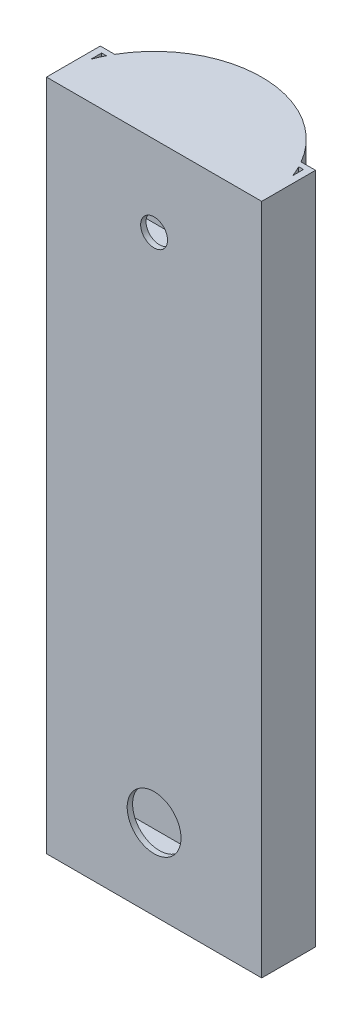
ISO-10303-21;
HEADER;
FILE_DESCRIPTION(('STEP AP214'),'2;1');
FILE_NAME('part.step','',(''),(''),'','','');
FILE_SCHEMA(('AUTOMOTIVE_DESIGN { 1 0 10303 214 1 1 1 1 }'));
ENDSEC;
DATA;
#1=APPLICATION_CONTEXT('core data for automotive mechanical design processes');
#2=APPLICATION_PROTOCOL_DEFINITION('international standard','automotive_design',2000,#1);
#3=PRODUCT_CONTEXT('',#1,'mechanical');
#4=PRODUCT('Part','Part','',(#3));
#5=PRODUCT_RELATED_PRODUCT_CATEGORY('part','',(#4));
#6=PRODUCT_DEFINITION_FORMATION('','',#4);
#7=PRODUCT_DEFINITION_CONTEXT('part definition',#1,'design');
#8=PRODUCT_DEFINITION('design','',#6,#7);
#9=PRODUCT_DEFINITION_SHAPE('','',#8);
#10=(LENGTH_UNIT() NAMED_UNIT(*) SI_UNIT(.MILLI.,.METRE.));
#11=(NAMED_UNIT(*) PLANE_ANGLE_UNIT() SI_UNIT($,.RADIAN.));
#12=(NAMED_UNIT(*) SI_UNIT($,.STERADIAN.) SOLID_ANGLE_UNIT());
#13=UNCERTAINTY_MEASURE_WITH_UNIT(LENGTH_MEASURE(1.E-05),#10,'distance_accuracy_value','');
#14=(GEOMETRIC_REPRESENTATION_CONTEXT(3) GLOBAL_UNCERTAINTY_ASSIGNED_CONTEXT((#13)) GLOBAL_UNIT_ASSIGNED_CONTEXT((#10,
#11,#12)) REPRESENTATION_CONTEXT('',''));
#15=CARTESIAN_POINT('',(0.,0.,0.));
#16=DIRECTION('',(0.,0.,1.));
#17=DIRECTION('',(1.,0.,0.));
#18=AXIS2_PLACEMENT_3D('',#15,#16,#17);
#19=CARTESIAN_POINT('',(-35.,245.,10.0000000000002));
#20=DIRECTION('',(0.,1.,0.));
#21=DIRECTION('',(-1.,0.,0.));
#22=AXIS2_PLACEMENT_3D('',#19,#20,#21);
#23=PLANE('',#22);
#24=CARTESIAN_POINT('',(0.,245.,10.));
#25=DIRECTION('',(0.,-1.,0.));
#26=DIRECTION('',(1.,0.,0.));
#27=AXIS2_PLACEMENT_3D('',#24,#25,#26);
#28=CIRCLE('',#27,35.);
#29=CARTESIAN_POINT('',(-28.7228132326901,245.,-10.));
#30=VERTEX_POINT('',#29);
#31=CARTESIAN_POINT('',(28.7228132326901,245.,-10.));
#32=VERTEX_POINT('',#31);
#33=EDGE_CURVE('E241',#30,#32,#28,.T.);
#34=ORIENTED_EDGE('',*,*,#33,.T.);
#35=DIRECTION('',(-1.,0.,0.));
#36=VECTOR('',#35,1.);
#37=CARTESIAN_POINT('',(40.,245.,-10.));
#38=LINE('',#37,#36);
#39=EDGE_CURVE('E509',#32,#30,#38,.T.);
#40=ORIENTED_EDGE('',*,*,#39,.T.);
#41=EDGE_LOOP('',(#34,#40));
#42=FACE_BOUND('',#41,.T.);
#43=ADVANCED_FACE('F41',(#42),#23,.F.);
#44=CARTESIAN_POINT('',(0.,0.,10.));
#45=DIRECTION('',(0.,-1.,0.));
#46=DIRECTION('',(1.,0.,0.));
#47=AXIS2_PLACEMENT_3D('',#44,#45,#46);
#48=CYLINDRICAL_SURFACE('',#47,35.);
#49=ORIENTED_EDGE('',*,*,#33,.F.);
#50=DIRECTION('',(0.,-1.,0.));
#51=VECTOR('',#50,1.);
#52=CARTESIAN_POINT('',(-28.7228132326901,0.,-10.));
#53=LINE('',#52,#51);
#54=CARTESIAN_POINT('',(-28.7228132326901,205.,-10.));
#55=VERTEX_POINT('',#54);
#56=EDGE_CURVE('E523',#30,#55,#53,.T.);
#57=ORIENTED_EDGE('',*,*,#56,.T.);
#58=CARTESIAN_POINT('',(0.,205.,10.));
#59=DIRECTION('',(0.,-1.,0.));
#60=DIRECTION('',(1.,0.,0.));
#61=AXIS2_PLACEMENT_3D('',#58,#59,#60);
#62=CIRCLE('',#61,35.);
#63=CARTESIAN_POINT('',(28.7228132326901,205.,-10.));
#64=VERTEX_POINT('',#63);
#65=EDGE_CURVE('E224',#55,#64,#62,.T.);
#66=ORIENTED_EDGE('',*,*,#65,.T.);
#67=DIRECTION('',(0.,-1.,0.));
#68=VECTOR('',#67,1.);
#69=CARTESIAN_POINT('',(28.7228132326901,0.,-10.));
#70=LINE('',#69,#68);
#71=EDGE_CURVE('E519',#64,#32,#70,.F.);
#72=ORIENTED_EDGE('',*,*,#71,.T.);
#73=EDGE_LOOP('',(#49,#57,#66,#72));
#74=FACE_BOUND('',#73,.T.);
#75=ADVANCED_FACE('F292',(#74),#48,.F.);
#76=CARTESIAN_POINT('',(0.,205.,10.));
#77=DIRECTION('',(0.,-1.,0.));
#78=DIRECTION('',(1.,0.,0.));
#79=AXIS2_PLACEMENT_3D('',#76,#77,#78);
#80=PLANE('',#79);
#81=CARTESIAN_POINT('',(0.,205.,-20.));
#82=DIRECTION('',(0.,-1.,0.));
#83=DIRECTION('',(1.,0.,0.));
#84=AXIS2_PLACEMENT_3D('',#81,#82,#83);
#85=CIRCLE('',#84,4.);
#86=CARTESIAN_POINT('',(4.,205.,-20.));
#87=VERTEX_POINT('',#86);
#88=EDGE_CURVE('E45',#87,#87,#85,.T.);
#89=ORIENTED_EDGE('',*,*,#88,.T.);
#90=EDGE_LOOP('',(#89));
#91=FACE_BOUND('',#90,.T.);
#92=ORIENTED_EDGE('',*,*,#65,.F.);
#93=DIRECTION('',(1.,0.,0.));
#94=VECTOR('',#93,1.);
#95=CARTESIAN_POINT('',(40.,205.,-10.));
#96=LINE('',#95,#94);
#97=EDGE_CURVE('E66',#55,#64,#96,.T.);
#98=ORIENTED_EDGE('',*,*,#97,.T.);
#99=EDGE_LOOP('',(#92,#98));
#100=FACE_BOUND('',#99,.T.);
#101=ADVANCED_FACE('F275',(#91,#100),#80,.F.);
#102=CARTESIAN_POINT('',(40.,200.,-10.));
#103=DIRECTION('',(0.,0.,1.));
#104=DIRECTION('',(1.,0.,0.));
#105=AXIS2_PLACEMENT_3D('',#102,#103,#104);
#106=PLANE('',#105);
#107=ORIENTED_EDGE('',*,*,#97,.F.);
#108=ORIENTED_EDGE('',*,*,#56,.F.);
#109=ORIENTED_EDGE('',*,*,#39,.F.);
#110=ORIENTED_EDGE('',*,*,#71,.F.);
#111=EDGE_LOOP('',(#107,#108,#109,#110));
#112=FACE_BOUND('',#111,.T.);
#113=ADVANCED_FACE('F281',(#112),#106,.F.);
#114=CARTESIAN_POINT('',(0.,215.,-20.));
#115=DIRECTION('',(0.,-1.,0.));
#116=DIRECTION('',(1.,0.,0.));
#117=AXIS2_PLACEMENT_3D('',#114,#115,#116);
#118=CYLINDRICAL_SURFACE('',#117,4.);
#119=CARTESIAN_POINT('',(0.,185.,-20.));
#120=DIRECTION('',(0.,-1.,0.));
#121=DIRECTION('',(0.,0.,-1.));
#122=AXIS2_PLACEMENT_3D('',#119,#120,#121);
#123=CIRCLE('',#122,4.);
#124=CARTESIAN_POINT('',(0.,185.,-24.));
#125=VERTEX_POINT('',#124);
#126=EDGE_CURVE('E266',#125,#125,#123,.T.);
#127=ORIENTED_EDGE('',*,*,#126,.T.);
#128=EDGE_LOOP('',(#127));
#129=FACE_BOUND('',#128,.T.);
#130=ORIENTED_EDGE('',*,*,#88,.F.);
#131=EDGE_LOOP('',(#130));
#132=FACE_BOUND('',#131,.T.);
#133=ADVANCED_FACE('F278',(#129,#132),#118,.F.);
#134=CARTESIAN_POINT('',(0.,40.,-10.));
#135=DIRECTION('',(0.,0.,1.));
#136=DIRECTION('',(1.,0.,0.));
#137=AXIS2_PLACEMENT_3D('',#134,#135,#136);
#138=CIRCLE('',#137,7.5);
#139=CARTESIAN_POINT('',(7.49999999999999,40.,-10.));
#140=VERTEX_POINT('',#139);
#141=EDGE_CURVE('E408',#140,#140,#138,.T.);
#142=ORIENTED_EDGE('',*,*,#141,.T.);
#143=EDGE_LOOP('',(#142));
#144=FACE_BOUND('',#143,.T.);
#145=DIRECTION('',(0.,-1.,0.));
#146=VECTOR('',#145,1.);
#147=CARTESIAN_POINT('',(-34.6410161513775,0.,-10.));
#148=LINE('',#147,#146);
#149=CARTESIAN_POINT('',(-34.6410161513775,200.,-10.));
#150=VERTEX_POINT('',#149);
#151=CARTESIAN_POINT('',(-34.6410161513775,250.,-10.));
#152=VERTEX_POINT('',#151);
#153=EDGE_CURVE('E499',#150,#152,#148,.F.);
#154=ORIENTED_EDGE('',*,*,#153,.F.);
#155=DIRECTION('',(-1.,0.,0.));
#156=VECTOR('',#155,1.);
#157=CARTESIAN_POINT('',(40.,200.,-10.));
#158=LINE('',#157,#156);
#159=CARTESIAN_POINT('',(34.6410161513775,200.,-10.));
#160=VERTEX_POINT('',#159);
#161=EDGE_CURVE('E58',#160,#150,#158,.T.);
#162=ORIENTED_EDGE('',*,*,#161,.F.);
#163=DIRECTION('',(0.,-1.,0.));
#164=VECTOR('',#163,1.);
#165=CARTESIAN_POINT('',(34.6410161513775,0.,-10.));
#166=LINE('',#165,#164);
#167=CARTESIAN_POINT('',(34.6410161513775,250.,-10.));
#168=VERTEX_POINT('',#167);
#169=EDGE_CURVE('E496',#168,#160,#166,.T.);
#170=ORIENTED_EDGE('',*,*,#169,.F.);
#171=DIRECTION('',(-1.,0.,0.));
#172=VECTOR('',#171,1.);
#173=CARTESIAN_POINT('',(0.,250.,-10.));
#174=LINE('',#173,#172);
#175=CARTESIAN_POINT('',(40.,250.,-10.));
#176=VERTEX_POINT('',#175);
#177=EDGE_CURVE('E392',#176,#168,#174,.T.);
#178=ORIENTED_EDGE('',*,*,#177,.F.);
#179=DIRECTION('',(0.,-1.,0.));
#180=VECTOR('',#179,1.);
#181=CARTESIAN_POINT('',(40.,200.,-10.));
#182=LINE('',#181,#180);
#183=CARTESIAN_POINT('',(40.,0.,-10.));
#184=VERTEX_POINT('',#183);
#185=EDGE_CURVE('E458',#176,#184,#182,.T.);
#186=ORIENTED_EDGE('',*,*,#185,.T.);
#187=DIRECTION('',(-1.,0.,0.));
#188=VECTOR('',#187,1.);
#189=CARTESIAN_POINT('',(40.,0.,-10.));
#190=LINE('',#189,#188);
#191=CARTESIAN_POINT('',(-40.,0.,-10.));
#192=VERTEX_POINT('',#191);
#193=EDGE_CURVE('E451',#184,#192,#190,.T.);
#194=ORIENTED_EDGE('',*,*,#193,.T.);
#195=DIRECTION('',(0.,-1.,0.));
#196=VECTOR('',#195,1.);
#197=CARTESIAN_POINT('',(-40.,200.,-10.));
#198=LINE('',#197,#196);
#199=CARTESIAN_POINT('',(-40.,250.,-10.));
#200=VERTEX_POINT('',#199);
#201=EDGE_CURVE('E454',#200,#192,#198,.T.);
#202=ORIENTED_EDGE('',*,*,#201,.F.);
#203=EDGE_CURVE('E391',#152,#200,#174,.T.);
#204=ORIENTED_EDGE('',*,*,#203,.F.);
#205=EDGE_LOOP('',(#154,#162,#170,#178,#186,#194,#202,#204));
#206=FACE_BOUND('',#205,.T.);
#207=ADVANCED_FACE('F280',(#144,#206),#106,.F.);
#208=CARTESIAN_POINT('',(37.5,10.,0.));
#209=DIRECTION('',(-1.,0.,0.));
#210=DIRECTION('',(0.,0.,1.));
#211=AXIS2_PLACEMENT_3D('',#208,#209,#210);
#212=PLANE('',#211);
#213=DIRECTION('',(0.,0.,-1.));
#214=VECTOR('',#213,1.);
#215=CARTESIAN_POINT('',(37.5,200.,0.));
#216=LINE('',#215,#214);
#217=CARTESIAN_POINT('',(37.5,200.,7.99999999999999));
#218=VERTEX_POINT('',#217);
#219=CARTESIAN_POINT('',(37.5,200.,-3.91941090707505));
#220=VERTEX_POINT('',#219);
#221=EDGE_CURVE('E376',#218,#220,#216,.T.);
#222=ORIENTED_EDGE('',*,*,#221,.T.);
#223=DIRECTION('',(0.,-1.,0.));
#224=VECTOR('',#223,1.);
#225=CARTESIAN_POINT('',(37.5,0.,-3.91941090707505));
#226=LINE('',#225,#224);
#227=CARTESIAN_POINT('',(37.5,250.,-3.91941090707505));
#228=VERTEX_POINT('',#227);
#229=EDGE_CURVE('E190',#220,#228,#226,.F.);
#230=ORIENTED_EDGE('',*,*,#229,.T.);
#231=DIRECTION('',(0.,0.,1.));
#232=VECTOR('',#231,1.);
#233=CARTESIAN_POINT('',(37.5,250.,0.));
#234=LINE('',#233,#232);
#235=CARTESIAN_POINT('',(37.5,250.,-8.00000000000001));
#236=VERTEX_POINT('',#235);
#237=EDGE_CURVE('E387',#236,#228,#234,.T.);
#238=ORIENTED_EDGE('',*,*,#237,.F.);
#239=DIRECTION('',(0.,1.,0.));
#240=VECTOR('',#239,1.);
#241=CARTESIAN_POINT('',(37.5,10.,-8.00000000000001));
#242=LINE('',#241,#240);
#243=CARTESIAN_POINT('',(37.5,10.,-8.00000000000001));
#244=VERTEX_POINT('',#243);
#245=EDGE_CURVE('E427',#244,#236,#242,.T.);
#246=ORIENTED_EDGE('',*,*,#245,.F.);
#247=DIRECTION('',(0.,0.,1.));
#248=VECTOR('',#247,1.);
#249=CARTESIAN_POINT('',(37.5,10.,0.));
#250=LINE('',#249,#248);
#251=CARTESIAN_POINT('',(37.5,10.,7.99999999999999));
#252=VERTEX_POINT('',#251);
#253=EDGE_CURVE('E413',#244,#252,#250,.T.);
#254=ORIENTED_EDGE('',*,*,#253,.T.);
#255=DIRECTION('',(0.,1.,0.));
#256=VECTOR('',#255,1.);
#257=CARTESIAN_POINT('',(37.5,10.,7.99999999999999));
#258=LINE('',#257,#256);
#259=EDGE_CURVE('E437',#252,#218,#258,.T.);
#260=ORIENTED_EDGE('',*,*,#259,.T.);
#261=EDGE_LOOP('',(#222,#230,#238,#246,#254,#260));
#262=FACE_BOUND('',#261,.T.);
#263=ADVANCED_FACE('F287',(#262),#212,.T.);
#264=CARTESIAN_POINT('',(0.,10.,8.));
#265=DIRECTION('',(0.,0.,1.));
#266=DIRECTION('',(1.,0.,0.));
#267=AXIS2_PLACEMENT_3D('',#264,#265,#266);
#268=PLANE('',#267);
#269=CARTESIAN_POINT('',(0.,30.,8.));
#270=DIRECTION('',(0.,0.,1.));
#271=DIRECTION('',(1.,0.,0.));
#272=AXIS2_PLACEMENT_3D('',#269,#270,#271);
#273=CIRCLE('',#272,10.);
#274=CARTESIAN_POINT('',(9.99999999999999,30.,8.));
#275=VERTEX_POINT('',#274);
#276=EDGE_CURVE('E251',#275,#275,#273,.T.);
#277=ORIENTED_EDGE('',*,*,#276,.T.);
#278=EDGE_LOOP('',(#277));
#279=FACE_BOUND('',#278,.T.);
#280=DIRECTION('',(-1.,0.,0.));
#281=VECTOR('',#280,1.);
#282=CARTESIAN_POINT('',(0.,200.,8.));
#283=LINE('',#282,#281);
#284=CARTESIAN_POINT('',(-37.5,200.,8.));
#285=VERTEX_POINT('',#284);
#286=EDGE_CURVE('E199',#218,#285,#283,.T.);
#287=ORIENTED_EDGE('',*,*,#286,.F.);
#288=ORIENTED_EDGE('',*,*,#259,.F.);
#289=DIRECTION('',(1.,0.,0.));
#290=VECTOR('',#289,1.);
#291=CARTESIAN_POINT('',(0.,10.,8.));
#292=LINE('',#291,#290);
#293=CARTESIAN_POINT('',(-37.5,10.,8.));
#294=VERTEX_POINT('',#293);
#295=EDGE_CURVE('E416',#294,#252,#292,.T.);
#296=ORIENTED_EDGE('',*,*,#295,.F.);
#297=DIRECTION('',(0.,1.,0.));
#298=VECTOR('',#297,1.);
#299=CARTESIAN_POINT('',(-37.5,10.,8.));
#300=LINE('',#299,#298);
#301=EDGE_CURVE('E434',#294,#285,#300,.T.);
#302=ORIENTED_EDGE('',*,*,#301,.T.);
#303=EDGE_LOOP('',(#287,#288,#296,#302));
#304=FACE_BOUND('',#303,.T.);
#305=ADVANCED_FACE('F341',(#279,#304),#268,.F.);
#306=CARTESIAN_POINT('',(0.,220.,8.));
#307=DIRECTION('',(0.,0.,1.));
#308=DIRECTION('',(1.,0.,0.));
#309=AXIS2_PLACEMENT_3D('',#306,#307,#308);
#310=CIRCLE('',#309,5.);
#311=CARTESIAN_POINT('',(4.99999999999999,220.,8.));
#312=VERTEX_POINT('',#311);
#313=EDGE_CURVE('E370',#312,#312,#310,.T.);
#314=ORIENTED_EDGE('',*,*,#313,.T.);
#315=EDGE_LOOP('',(#314));
#316=FACE_BOUND('',#315,.T.);
#317=DIRECTION('',(1.,0.,0.));
#318=VECTOR('',#317,1.);
#319=CARTESIAN_POINT('',(0.,205.,8.));
#320=LINE('',#319,#318);
#321=CARTESIAN_POINT('',(-34.9428104193123,205.,8.));
#322=VERTEX_POINT('',#321);
#323=CARTESIAN_POINT('',(34.9428104193123,205.,7.99999999999999));
#324=VERTEX_POINT('',#323);
#325=EDGE_CURVE('E526',#322,#324,#320,.T.);
#326=ORIENTED_EDGE('',*,*,#325,.F.);
#327=DIRECTION('',(0.,-1.,0.));
#328=VECTOR('',#327,1.);
#329=CARTESIAN_POINT('',(-34.9428104193123,0.,8.));
#330=LINE('',#329,#328);
#331=CARTESIAN_POINT('',(-34.9428104193123,245.,8.));
#332=VERTEX_POINT('',#331);
#333=EDGE_CURVE('E516',#332,#322,#330,.T.);
#334=ORIENTED_EDGE('',*,*,#333,.F.);
#335=DIRECTION('',(-1.,0.,0.));
#336=VECTOR('',#335,1.);
#337=CARTESIAN_POINT('',(0.,245.,8.));
#338=LINE('',#337,#336);
#339=CARTESIAN_POINT('',(34.9428104193123,245.,7.99999999999999));
#340=VERTEX_POINT('',#339);
#341=EDGE_CURVE('E506',#340,#332,#338,.T.);
#342=ORIENTED_EDGE('',*,*,#341,.F.);
#343=DIRECTION('',(0.,-1.,0.));
#344=VECTOR('',#343,1.);
#345=CARTESIAN_POINT('',(34.9428104193123,0.,7.99999999999999));
#346=LINE('',#345,#344);
#347=EDGE_CURVE('E513',#324,#340,#346,.F.);
#348=ORIENTED_EDGE('',*,*,#347,.F.);
#349=EDGE_LOOP('',(#326,#334,#342,#348));
#350=FACE_BOUND('',#349,.T.);
#351=ADVANCED_FACE('F340',(#316,#350),#268,.F.);
#352=CARTESIAN_POINT('',(-37.5,10.,0.));
#353=DIRECTION('',(-1.,0.,0.));
#354=DIRECTION('',(0.,0.,1.));
#355=AXIS2_PLACEMENT_3D('',#352,#353,#354);
#356=PLANE('',#355);
#357=DIRECTION('',(0.,-1.,0.));
#358=VECTOR('',#357,1.);
#359=CARTESIAN_POINT('',(-37.5,0.,-3.91941090707501));
#360=LINE('',#359,#358);
#361=CARTESIAN_POINT('',(-37.5,200.,-3.91941090707501));
#362=VERTEX_POINT('',#361);
#363=CARTESIAN_POINT('',(-37.5,250.,-3.91941090707501));
#364=VERTEX_POINT('',#363);
#365=EDGE_CURVE('E179',#362,#364,#360,.F.);
#366=ORIENTED_EDGE('',*,*,#365,.F.);
#367=DIRECTION('',(0.,0.,-1.));
#368=VECTOR('',#367,1.);
#369=CARTESIAN_POINT('',(-37.5,200.,0.));
#370=LINE('',#369,#368);
#371=EDGE_CURVE('E182',#285,#362,#370,.T.);
#372=ORIENTED_EDGE('',*,*,#371,.F.);
#373=ORIENTED_EDGE('',*,*,#301,.F.);
#374=DIRECTION('',(0.,0.,1.));
#375=VECTOR('',#374,1.);
#376=CARTESIAN_POINT('',(-37.5,10.,0.));
#377=LINE('',#376,#375);
#378=CARTESIAN_POINT('',(-37.5,10.,-8.));
#379=VERTEX_POINT('',#378);
#380=EDGE_CURVE('E420',#379,#294,#377,.T.);
#381=ORIENTED_EDGE('',*,*,#380,.F.);
#382=DIRECTION('',(0.,1.,0.));
#383=VECTOR('',#382,1.);
#384=CARTESIAN_POINT('',(-37.5,10.,-8.));
#385=LINE('',#384,#383);
#386=CARTESIAN_POINT('',(-37.5,250.,-8.));
#387=VERTEX_POINT('',#386);
#388=EDGE_CURVE('E431',#379,#387,#385,.T.);
#389=ORIENTED_EDGE('',*,*,#388,.T.);
#390=DIRECTION('',(0.,0.,-1.));
#391=VECTOR('',#390,1.);
#392=CARTESIAN_POINT('',(-37.5,250.,0.));
#393=LINE('',#392,#391);
#394=EDGE_CURVE('E185',#364,#387,#393,.T.);
#395=ORIENTED_EDGE('',*,*,#394,.F.);
#396=EDGE_LOOP('',(#366,#372,#373,#381,#389,#395));
#397=FACE_BOUND('',#396,.T.);
#398=ADVANCED_FACE('F181',(#397),#356,.F.);
#399=CARTESIAN_POINT('',(0.,10.,-8.));
#400=DIRECTION('',(0.,0.,1.));
#401=DIRECTION('',(1.,0.,0.));
#402=AXIS2_PLACEMENT_3D('',#399,#400,#401);
#403=PLANE('',#402);
#404=CARTESIAN_POINT('',(0.,40.,-8.));
#405=DIRECTION('',(0.,0.,1.));
#406=DIRECTION('',(1.,0.,0.));
#407=AXIS2_PLACEMENT_3D('',#404,#405,#406);
#408=CIRCLE('',#407,7.5);
#409=CARTESIAN_POINT('',(7.49999999999999,40.,-8.));
#410=VERTEX_POINT('',#409);
#411=EDGE_CURVE('E412',#410,#410,#408,.F.);
#412=ORIENTED_EDGE('',*,*,#411,.T.);
#413=EDGE_LOOP('',(#412));
#414=FACE_BOUND('',#413,.T.);
#415=DIRECTION('',(-1.,0.,0.));
#416=VECTOR('',#415,1.);
#417=CARTESIAN_POINT('',(0.,200.,-8.));
#418=LINE('',#417,#416);
#419=CARTESIAN_POINT('',(35.7211421989835,200.,-8.00000000000001));
#420=VERTEX_POINT('',#419);
#421=CARTESIAN_POINT('',(-35.7211421989835,200.,-8.));
#422=VERTEX_POINT('',#421);
#423=EDGE_CURVE('E51',#420,#422,#418,.T.);
#424=ORIENTED_EDGE('',*,*,#423,.T.);
#425=DIRECTION('',(0.,-1.,0.));
#426=VECTOR('',#425,1.);
#427=CARTESIAN_POINT('',(-35.7211421989835,0.,-8.));
#428=LINE('',#427,#426);
#429=CARTESIAN_POINT('',(-35.7211421989835,250.,-8.));
#430=VERTEX_POINT('',#429);
#431=EDGE_CURVE('E191',#422,#430,#428,.F.);
#432=ORIENTED_EDGE('',*,*,#431,.T.);
#433=DIRECTION('',(1.,0.,0.));
#434=VECTOR('',#433,1.);
#435=CARTESIAN_POINT('',(0.,250.,-8.));
#436=LINE('',#435,#434);
#437=EDGE_CURVE('E383',#387,#430,#436,.T.);
#438=ORIENTED_EDGE('',*,*,#437,.F.);
#439=ORIENTED_EDGE('',*,*,#388,.F.);
#440=DIRECTION('',(1.,0.,0.));
#441=VECTOR('',#440,1.);
#442=CARTESIAN_POINT('',(0.,10.,-8.));
#443=LINE('',#442,#441);
#444=EDGE_CURVE('E424',#379,#244,#443,.T.);
#445=ORIENTED_EDGE('',*,*,#444,.T.);
#446=ORIENTED_EDGE('',*,*,#245,.T.);
#447=CARTESIAN_POINT('',(35.7211421989835,250.,-8.00000000000001));
#448=VERTEX_POINT('',#447);
#449=EDGE_CURVE('E382',#448,#236,#436,.T.);
#450=ORIENTED_EDGE('',*,*,#449,.F.);
#451=DIRECTION('',(0.,-1.,0.));
#452=VECTOR('',#451,1.);
#453=CARTESIAN_POINT('',(35.7211421989835,0.,-8.00000000000001));
#454=LINE('',#453,#452);
#455=EDGE_CURVE('E490',#448,#420,#454,.T.);
#456=ORIENTED_EDGE('',*,*,#455,.T.);
#457=EDGE_LOOP('',(#424,#432,#438,#439,#445,#446,#450,#456));
#458=FACE_BOUND('',#457,.T.);
#459=ADVANCED_FACE('F333',(#414,#458),#403,.T.);
#460=CARTESIAN_POINT('',(-40.,200.,10.));
#461=DIRECTION('',(1.,0.,0.));
#462=DIRECTION('',(0.,0.,-1.));
#463=AXIS2_PLACEMENT_3D('',#460,#461,#462);
#464=PLANE('',#463);
#465=DIRECTION('',(0.,0.,1.));
#466=VECTOR('',#465,1.);
#467=CARTESIAN_POINT('',(-40.,0.,10.));
#468=LINE('',#467,#466);
#469=CARTESIAN_POINT('',(-40.,0.,10.));
#470=VERTEX_POINT('',#469);
#471=EDGE_CURVE('E441',#192,#470,#468,.T.);
#472=ORIENTED_EDGE('',*,*,#471,.T.);
#473=DIRECTION('',(0.,-1.,0.));
#474=VECTOR('',#473,1.);
#475=CARTESIAN_POINT('',(-40.,200.,10.));
#476=LINE('',#475,#474);
#477=CARTESIAN_POINT('',(-40.,250.,10.));
#478=VERTEX_POINT('',#477);
#479=EDGE_CURVE('E365',#478,#470,#476,.T.);
#480=ORIENTED_EDGE('',*,*,#479,.F.);
#481=DIRECTION('',(0.,0.,1.));
#482=VECTOR('',#481,1.);
#483=CARTESIAN_POINT('',(-40.,250.,0.));
#484=LINE('',#483,#482);
#485=EDGE_CURVE('E396',#200,#478,#484,.T.);
#486=ORIENTED_EDGE('',*,*,#485,.F.);
#487=ORIENTED_EDGE('',*,*,#201,.T.);
#488=EDGE_LOOP('',(#472,#480,#486,#487));
#489=FACE_BOUND('',#488,.T.);
#490=ADVANCED_FACE('F43',(#489),#464,.F.);
#491=CARTESIAN_POINT('',(40.,200.,9.99999999999999));
#492=DIRECTION('',(0.,0.,-1.));
#493=DIRECTION('',(-1.,0.,0.));
#494=AXIS2_PLACEMENT_3D('',#491,#492,#493);
#495=PLANE('',#494);
#496=CARTESIAN_POINT('',(0.,30.,10.));
#497=DIRECTION('',(0.,0.,1.));
#498=DIRECTION('',(1.,0.,0.));
#499=AXIS2_PLACEMENT_3D('',#496,#497,#498);
#500=CIRCLE('',#499,10.);
#501=CARTESIAN_POINT('',(9.99999999999999,30.,10.));
#502=VERTEX_POINT('',#501);
#503=EDGE_CURVE('E255',#502,#502,#500,.T.);
#504=ORIENTED_EDGE('',*,*,#503,.F.);
#505=EDGE_LOOP('',(#504));
#506=FACE_BOUND('',#505,.T.);
#507=ORIENTED_EDGE('',*,*,#479,.T.);
#508=DIRECTION('',(1.,0.,0.));
#509=VECTOR('',#508,1.);
#510=CARTESIAN_POINT('',(40.,0.,9.99999999999999));
#511=LINE('',#510,#509);
#512=CARTESIAN_POINT('',(40.,0.,9.99999999999999));
#513=VERTEX_POINT('',#512);
#514=EDGE_CURVE('E445',#470,#513,#511,.T.);
#515=ORIENTED_EDGE('',*,*,#514,.T.);
#516=DIRECTION('',(0.,-1.,0.));
#517=VECTOR('',#516,1.);
#518=CARTESIAN_POINT('',(40.,200.,9.99999999999999));
#519=LINE('',#518,#517);
#520=CARTESIAN_POINT('',(40.,250.,9.99999999999999));
#521=VERTEX_POINT('',#520);
#522=EDGE_CURVE('E462',#521,#513,#519,.T.);
#523=ORIENTED_EDGE('',*,*,#522,.F.);
#524=DIRECTION('',(1.,0.,0.));
#525=VECTOR('',#524,1.);
#526=CARTESIAN_POINT('',(0.,250.,10.));
#527=LINE('',#526,#525);
#528=EDGE_CURVE('E400',#478,#521,#527,.T.);
#529=ORIENTED_EDGE('',*,*,#528,.F.);
#530=EDGE_LOOP('',(#507,#515,#523,#529));
#531=FACE_BOUND('',#530,.T.);
#532=CARTESIAN_POINT('',(0.,220.,10.));
#533=DIRECTION('',(0.,0.,1.));
#534=DIRECTION('',(1.,0.,0.));
#535=AXIS2_PLACEMENT_3D('',#532,#533,#534);
#536=CIRCLE('',#535,5.);
#537=CARTESIAN_POINT('',(4.99999999999999,220.,10.));
#538=VERTEX_POINT('',#537);
#539=EDGE_CURVE('E368',#538,#538,#536,.T.);
#540=ORIENTED_EDGE('',*,*,#539,.F.);
#541=EDGE_LOOP('',(#540));
#542=FACE_BOUND('',#541,.T.);
#543=ADVANCED_FACE('F352',(#506,#531,#542),#495,.F.);
#544=CARTESIAN_POINT('',(40.,200.,9.99999999999999));
#545=DIRECTION('',(-1.,0.,0.));
#546=DIRECTION('',(0.,0.,1.));
#547=AXIS2_PLACEMENT_3D('',#544,#545,#546);
#548=PLANE('',#547);
#549=DIRECTION('',(0.,0.,-1.));
#550=VECTOR('',#549,1.);
#551=CARTESIAN_POINT('',(40.,0.,9.99999999999999));
#552=LINE('',#551,#550);
#553=EDGE_CURVE('E448',#513,#184,#552,.T.);
#554=ORIENTED_EDGE('',*,*,#553,.T.);
#555=ORIENTED_EDGE('',*,*,#185,.F.);
#556=DIRECTION('',(0.,0.,-1.));
#557=VECTOR('',#556,1.);
#558=CARTESIAN_POINT('',(40.,250.,0.));
#559=LINE('',#558,#557);
#560=EDGE_CURVE('E404',#521,#176,#559,.T.);
#561=ORIENTED_EDGE('',*,*,#560,.F.);
#562=ORIENTED_EDGE('',*,*,#522,.T.);
#563=EDGE_LOOP('',(#554,#555,#561,#562));
#564=FACE_BOUND('',#563,.T.);
#565=ADVANCED_FACE('F348',(#564),#548,.F.);
#566=CARTESIAN_POINT('',(0.,0.,0.));
#567=DIRECTION('',(0.,1.,0.));
#568=DIRECTION('',(0.,0.,1.));
#569=AXIS2_PLACEMENT_3D('',#566,#567,#568);
#570=PLANE('',#569);
#571=ORIENTED_EDGE('',*,*,#471,.F.);
#572=ORIENTED_EDGE('',*,*,#193,.F.);
#573=ORIENTED_EDGE('',*,*,#553,.F.);
#574=ORIENTED_EDGE('',*,*,#514,.F.);
#575=EDGE_LOOP('',(#571,#572,#573,#574));
#576=FACE_BOUND('',#575,.T.);
#577=ADVANCED_FACE('F331',(#576),#570,.F.);
#578=CARTESIAN_POINT('',(0.,10.,0.));
#579=DIRECTION('',(0.,1.,0.));
#580=DIRECTION('',(0.,0.,1.));
#581=AXIS2_PLACEMENT_3D('',#578,#579,#580);
#582=PLANE('',#581);
#583=ORIENTED_EDGE('',*,*,#253,.F.);
#584=ORIENTED_EDGE('',*,*,#444,.F.);
#585=ORIENTED_EDGE('',*,*,#380,.T.);
#586=ORIENTED_EDGE('',*,*,#295,.T.);
#587=EDGE_LOOP('',(#583,#584,#585,#586));
#588=FACE_BOUND('',#587,.T.);
#589=ADVANCED_FACE('F327',(#588),#582,.T.);
#590=CARTESIAN_POINT('',(0.,40.,0.));
#591=DIRECTION('',(0.,0.,-1.));
#592=DIRECTION('',(-1.,0.,0.));
#593=AXIS2_PLACEMENT_3D('',#590,#591,#592);
#594=CYLINDRICAL_SURFACE('',#593,7.5);
#595=ORIENTED_EDGE('',*,*,#411,.F.);
#596=EDGE_LOOP('',(#595));
#597=FACE_BOUND('',#596,.T.);
#598=ORIENTED_EDGE('',*,*,#141,.F.);
#599=EDGE_LOOP('',(#598));
#600=FACE_BOUND('',#599,.T.);
#601=ADVANCED_FACE('F316',(#597,#600),#594,.F.);
#602=CARTESIAN_POINT('',(0.,250.,0.));
#603=DIRECTION('',(0.,1.,0.));
#604=DIRECTION('',(0.,0.,1.));
#605=AXIS2_PLACEMENT_3D('',#602,#603,#604);
#606=PLANE('',#605);
#607=CARTESIAN_POINT('',(0.,250.,10.));
#608=DIRECTION('',(0.,-1.,0.));
#609=DIRECTION('',(1.,0.,0.));
#610=AXIS2_PLACEMENT_3D('',#607,#608,#609);
#611=CIRCLE('',#610,40.);
#612=EDGE_CURVE('E215',#364,#430,#611,.T.);
#613=ORIENTED_EDGE('',*,*,#612,.F.);
#614=ORIENTED_EDGE('',*,*,#394,.T.);
#615=ORIENTED_EDGE('',*,*,#437,.T.);
#616=EDGE_LOOP('',(#613,#614,#615));
#617=FACE_BOUND('',#616,.T.);
#618=ORIENTED_EDGE('',*,*,#237,.T.);
#619=EDGE_CURVE('E206',#448,#228,#611,.T.);
#620=ORIENTED_EDGE('',*,*,#619,.F.);
#621=ORIENTED_EDGE('',*,*,#449,.T.);
#622=EDGE_LOOP('',(#618,#620,#621));
#623=FACE_BOUND('',#622,.T.);
#624=ORIENTED_EDGE('',*,*,#177,.T.);
#625=EDGE_CURVE('E213',#152,#168,#611,.T.);
#626=ORIENTED_EDGE('',*,*,#625,.F.);
#627=ORIENTED_EDGE('',*,*,#203,.T.);
#628=ORIENTED_EDGE('',*,*,#485,.T.);
#629=ORIENTED_EDGE('',*,*,#528,.T.);
#630=ORIENTED_EDGE('',*,*,#560,.T.);
#631=EDGE_LOOP('',(#624,#626,#627,#628,#629,#630));
#632=FACE_BOUND('',#631,.T.);
#633=ADVANCED_FACE('F310',(#617,#623,#632),#606,.T.);
#634=CARTESIAN_POINT('',(0.,220.,0.));
#635=DIRECTION('',(0.,0.,1.));
#636=DIRECTION('',(1.,0.,0.));
#637=AXIS2_PLACEMENT_3D('',#634,#635,#636);
#638=CYLINDRICAL_SURFACE('',#637,5.);
#639=ORIENTED_EDGE('',*,*,#539,.T.);
#640=EDGE_LOOP('',(#639));
#641=FACE_BOUND('',#640,.T.);
#642=ORIENTED_EDGE('',*,*,#313,.F.);
#643=EDGE_LOOP('',(#642));
#644=FACE_BOUND('',#643,.T.);
#645=ADVANCED_FACE('F305',(#641,#644),#638,.F.);
#646=CARTESIAN_POINT('',(30.0166620396073,245.,-8.00000000000001));
#647=VERTEX_POINT('',#646);
#648=EDGE_CURVE('E242',#647,#340,#28,.T.);
#649=ORIENTED_EDGE('',*,*,#648,.T.);
#650=ORIENTED_EDGE('',*,*,#341,.T.);
#651=CARTESIAN_POINT('',(-30.0166620396073,245.,-8.));
#652=VERTEX_POINT('',#651);
#653=EDGE_CURVE('E236',#332,#652,#28,.T.);
#654=ORIENTED_EDGE('',*,*,#653,.T.);
#655=DIRECTION('',(-1.,0.,0.));
#656=VECTOR('',#655,1.);
#657=CARTESIAN_POINT('',(0.,245.,-8.));
#658=LINE('',#657,#656);
#659=EDGE_CURVE('E467',#647,#652,#658,.T.);
#660=ORIENTED_EDGE('',*,*,#659,.F.);
#661=EDGE_LOOP('',(#649,#650,#654,#660));
#662=FACE_BOUND('',#661,.T.);
#663=ADVANCED_FACE('F295',(#662),#23,.F.);
#664=CARTESIAN_POINT('',(30.0166620396073,205.,-8.00000000000001));
#665=VERTEX_POINT('',#664);
#666=EDGE_CURVE('E225',#665,#324,#62,.T.);
#667=ORIENTED_EDGE('',*,*,#666,.T.);
#668=ORIENTED_EDGE('',*,*,#347,.T.);
#669=ORIENTED_EDGE('',*,*,#648,.F.);
#670=DIRECTION('',(0.,-1.,0.));
#671=VECTOR('',#670,1.);
#672=CARTESIAN_POINT('',(30.0166620396073,0.,-8.00000000000001));
#673=LINE('',#672,#671);
#674=EDGE_CURVE('E474',#665,#647,#673,.F.);
#675=ORIENTED_EDGE('',*,*,#674,.F.);
#676=EDGE_LOOP('',(#667,#668,#669,#675));
#677=FACE_BOUND('',#676,.T.);
#678=ADVANCED_FACE('F302',(#677),#48,.F.);
#679=ORIENTED_EDGE('',*,*,#653,.F.);
#680=ORIENTED_EDGE('',*,*,#333,.T.);
#681=CARTESIAN_POINT('',(-30.0166620396073,205.,-8.));
#682=VERTEX_POINT('',#681);
#683=EDGE_CURVE('E220',#322,#682,#62,.T.);
#684=ORIENTED_EDGE('',*,*,#683,.T.);
#685=DIRECTION('',(0.,-1.,0.));
#686=VECTOR('',#685,1.);
#687=CARTESIAN_POINT('',(-30.0166620396073,0.,-8.));
#688=LINE('',#687,#686);
#689=EDGE_CURVE('E478',#652,#682,#688,.T.);
#690=ORIENTED_EDGE('',*,*,#689,.F.);
#691=EDGE_LOOP('',(#679,#680,#684,#690));
#692=FACE_BOUND('',#691,.T.);
#693=ADVANCED_FACE('F301',(#692),#48,.F.);
#694=ORIENTED_EDGE('',*,*,#683,.F.);
#695=ORIENTED_EDGE('',*,*,#325,.T.);
#696=ORIENTED_EDGE('',*,*,#666,.F.);
#697=DIRECTION('',(1.,0.,0.));
#698=VECTOR('',#697,1.);
#699=CARTESIAN_POINT('',(0.,205.,-8.));
#700=LINE('',#699,#698);
#701=EDGE_CURVE('E481',#682,#665,#700,.T.);
#702=ORIENTED_EDGE('',*,*,#701,.F.);
#703=EDGE_LOOP('',(#694,#695,#696,#702));
#704=FACE_BOUND('',#703,.T.);
#705=ADVANCED_FACE('F573',(#704),#80,.F.);
#706=CARTESIAN_POINT('',(-40.,200.,10.0000000000003));
#707=DIRECTION('',(0.,1.,0.));
#708=DIRECTION('',(-1.,0.,0.));
#709=AXIS2_PLACEMENT_3D('',#706,#707,#708);
#710=PLANE('',#709);
#711=ORIENTED_EDGE('',*,*,#221,.F.);
#712=ORIENTED_EDGE('',*,*,#286,.T.);
#713=ORIENTED_EDGE('',*,*,#371,.T.);
#714=CARTESIAN_POINT('',(0.,200.,10.));
#715=DIRECTION('',(0.,-1.,0.));
#716=DIRECTION('',(1.,0.,0.));
#717=AXIS2_PLACEMENT_3D('',#714,#715,#716);
#718=CIRCLE('',#717,40.);
#719=EDGE_CURVE('E197',#362,#422,#718,.T.);
#720=ORIENTED_EDGE('',*,*,#719,.T.);
#721=ORIENTED_EDGE('',*,*,#423,.F.);
#722=EDGE_CURVE('E209',#420,#220,#718,.T.);
#723=ORIENTED_EDGE('',*,*,#722,.T.);
#724=EDGE_LOOP('',(#711,#712,#713,#720,#721,#723));
#725=FACE_BOUND('',#724,.T.);
#726=ADVANCED_FACE('F196',(#725),#710,.F.);
#727=CARTESIAN_POINT('',(0.,0.,10.));
#728=DIRECTION('',(0.,-1.,0.));
#729=DIRECTION('',(1.,0.,0.));
#730=AXIS2_PLACEMENT_3D('',#727,#728,#729);
#731=CYLINDRICAL_SURFACE('',#730,40.);
#732=ORIENTED_EDGE('',*,*,#229,.F.);
#733=ORIENTED_EDGE('',*,*,#722,.F.);
#734=ORIENTED_EDGE('',*,*,#455,.F.);
#735=ORIENTED_EDGE('',*,*,#619,.T.);
#736=EDGE_LOOP('',(#732,#733,#734,#735));
#737=FACE_BOUND('',#736,.T.);
#738=ADVANCED_FACE('F322',(#737),#731,.T.);
#739=ORIENTED_EDGE('',*,*,#719,.F.);
#740=ORIENTED_EDGE('',*,*,#365,.T.);
#741=ORIENTED_EDGE('',*,*,#612,.T.);
#742=ORIENTED_EDGE('',*,*,#431,.F.);
#743=EDGE_LOOP('',(#739,#740,#741,#742));
#744=FACE_BOUND('',#743,.T.);
#745=ADVANCED_FACE('F202',(#744),#731,.T.);
#746=CARTESIAN_POINT('',(0.,200.,-20.));
#747=DIRECTION('',(0.,1.,0.));
#748=DIRECTION('',(-1.,0.,0.));
#749=AXIS2_PLACEMENT_3D('',#746,#747,#748);
#750=CIRCLE('',#749,5.);
#751=CARTESIAN_POINT('',(-5.,200.,-20.));
#752=VERTEX_POINT('',#751);
#753=EDGE_CURVE('E11',#752,#752,#750,.F.);
#754=ORIENTED_EDGE('',*,*,#753,.F.);
#755=EDGE_LOOP('',(#754));
#756=FACE_BOUND('',#755,.T.);
#757=EDGE_CURVE('E207',#150,#160,#718,.T.);
#758=ORIENTED_EDGE('',*,*,#757,.T.);
#759=ORIENTED_EDGE('',*,*,#161,.T.);
#760=EDGE_LOOP('',(#758,#759));
#761=FACE_BOUND('',#760,.T.);
#762=ADVANCED_FACE('F563',(#756,#761),#710,.F.);
#763=ORIENTED_EDGE('',*,*,#757,.F.);
#764=ORIENTED_EDGE('',*,*,#153,.T.);
#765=ORIENTED_EDGE('',*,*,#625,.T.);
#766=ORIENTED_EDGE('',*,*,#169,.T.);
#767=EDGE_LOOP('',(#763,#764,#765,#766));
#768=FACE_BOUND('',#767,.T.);
#769=ADVANCED_FACE('F551',(#768),#731,.T.);
#770=ORIENTED_EDGE('',*,*,#689,.T.);
#771=ORIENTED_EDGE('',*,*,#701,.T.);
#772=ORIENTED_EDGE('',*,*,#674,.T.);
#773=ORIENTED_EDGE('',*,*,#659,.T.);
#774=EDGE_LOOP('',(#770,#771,#772,#773));
#775=FACE_BOUND('',#774,.T.);
#776=ADVANCED_FACE('F337',(#775),#403,.T.);
#777=CARTESIAN_POINT('',(0.,30.,0.));
#778=DIRECTION('',(0.,0.,1.));
#779=DIRECTION('',(1.,0.,0.));
#780=AXIS2_PLACEMENT_3D('',#777,#778,#779);
#781=CYLINDRICAL_SURFACE('',#780,10.);
#782=ORIENTED_EDGE('',*,*,#503,.T.);
#783=EDGE_LOOP('',(#782));
#784=FACE_BOUND('',#783,.T.);
#785=ORIENTED_EDGE('',*,*,#276,.F.);
#786=EDGE_LOOP('',(#785));
#787=FACE_BOUND('',#786,.T.);
#788=ADVANCED_FACE('F616',(#784,#787),#781,.F.);
#789=CARTESIAN_POINT('',(0.,185.,-20.));
#790=DIRECTION('',(0.,1.,0.));
#791=DIRECTION('',(-1.,0.,0.));
#792=AXIS2_PLACEMENT_3D('',#789,#790,#791);
#793=CYLINDRICAL_SURFACE('',#792,5.);
#794=CARTESIAN_POINT('',(0.,185.,-20.));
#795=DIRECTION('',(0.,-1.,0.));
#796=DIRECTION('',(1.,0.,0.));
#797=AXIS2_PLACEMENT_3D('',#794,#795,#796);
#798=CIRCLE('',#797,5.);
#799=CARTESIAN_POINT('',(5.,185.,-20.));
#800=VERTEX_POINT('',#799);
#801=EDGE_CURVE('E260',#800,#800,#798,.T.);
#802=ORIENTED_EDGE('',*,*,#801,.F.);
#803=EDGE_LOOP('',(#802));
#804=FACE_BOUND('',#803,.T.);
#805=ORIENTED_EDGE('',*,*,#753,.T.);
#806=EDGE_LOOP('',(#805));
#807=FACE_BOUND('',#806,.T.);
#808=ADVANCED_FACE('F620',(#804,#807),#793,.T.);
#809=CARTESIAN_POINT('',(0.,185.,-20.));
#810=DIRECTION('',(0.,-1.,0.));
#811=DIRECTION('',(1.,0.,0.));
#812=AXIS2_PLACEMENT_3D('',#809,#810,#811);
#813=PLANE('',#812);
#814=ORIENTED_EDGE('',*,*,#126,.F.);
#815=EDGE_LOOP('',(#814));
#816=FACE_BOUND('',#815,.T.);
#817=ORIENTED_EDGE('',*,*,#801,.T.);
#818=EDGE_LOOP('',(#817));
#819=FACE_BOUND('',#818,.T.);
#820=ADVANCED_FACE('F635',(#816,#819),#813,.T.);
#821=CLOSED_SHELL('',(#43,#75,#101,#113,#133,#207,#263,#305,#351,#398,#459,#490,#543,#565,#577,
#589,#601,#633,#645,#663,#678,#693,#705,#726,#738,#745,#762,#769,#776,#788,#808,#820));
#822=MANIFOLD_SOLID_BREP('B2',#821);
#823=ADVANCED_BREP_SHAPE_REPRESENTATION('',(#18,#822),#14);
#824=SHAPE_DEFINITION_REPRESENTATION(#9,#823);
ENDSEC;
END-ISO-10303-21;
